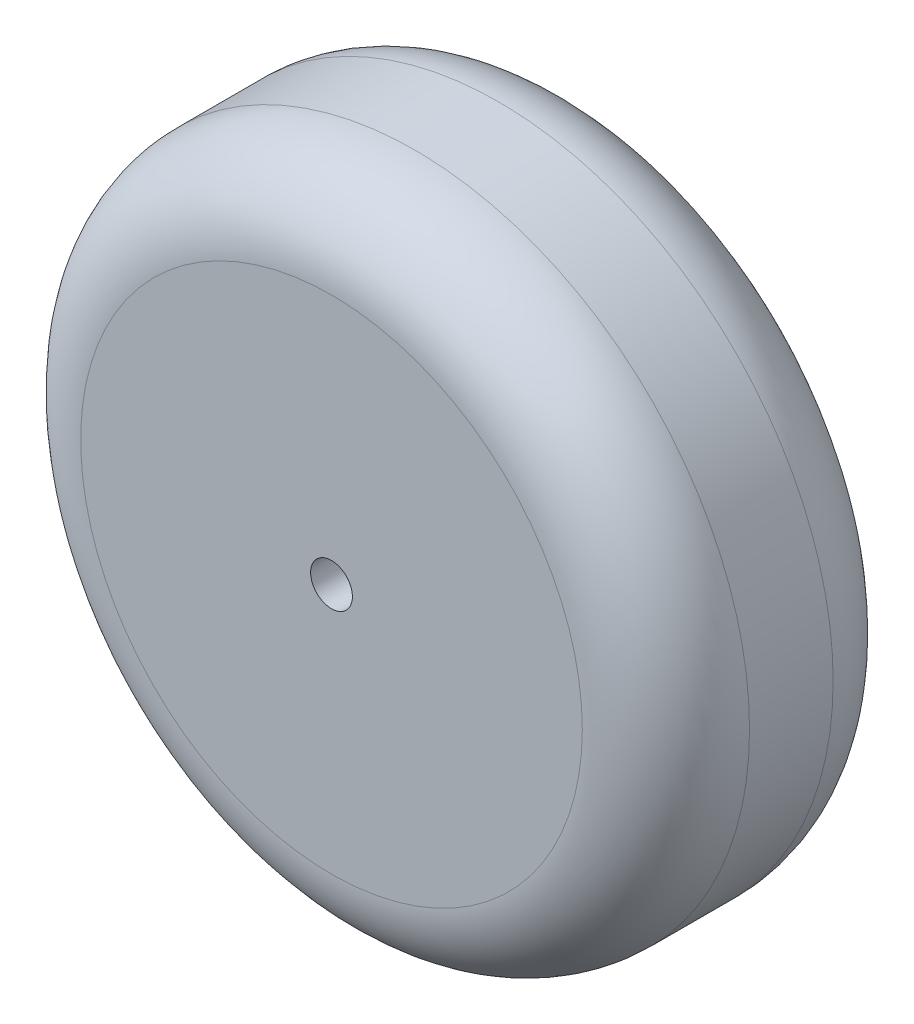
ISO-10303-21;
HEADER;
FILE_DESCRIPTION(('STEP AP214'),'2;1');
FILE_NAME('part.step','',(''),(''),'','','');
FILE_SCHEMA(('AUTOMOTIVE_DESIGN { 1 0 10303 214 1 1 1 1 }'));
ENDSEC;
DATA;
#1=APPLICATION_CONTEXT('core data for automotive mechanical design processes');
#2=APPLICATION_PROTOCOL_DEFINITION('international standard','automotive_design',2000,#1);
#3=PRODUCT_CONTEXT('',#1,'mechanical');
#4=PRODUCT('Part','Part','',(#3));
#5=PRODUCT_RELATED_PRODUCT_CATEGORY('part','',(#4));
#6=PRODUCT_DEFINITION_FORMATION('','',#4);
#7=PRODUCT_DEFINITION_CONTEXT('part definition',#1,'design');
#8=PRODUCT_DEFINITION('design','',#6,#7);
#9=PRODUCT_DEFINITION_SHAPE('','',#8);
#10=(LENGTH_UNIT() NAMED_UNIT(*) SI_UNIT(.MILLI.,.METRE.));
#11=(NAMED_UNIT(*) PLANE_ANGLE_UNIT() SI_UNIT($,.RADIAN.));
#12=(NAMED_UNIT(*) SI_UNIT($,.STERADIAN.) SOLID_ANGLE_UNIT());
#13=UNCERTAINTY_MEASURE_WITH_UNIT(LENGTH_MEASURE(1.E-05),#10,'distance_accuracy_value','');
#14=(GEOMETRIC_REPRESENTATION_CONTEXT(3) GLOBAL_UNCERTAINTY_ASSIGNED_CONTEXT((#13)) GLOBAL_UNIT_ASSIGNED_CONTEXT((#10,
#11,#12)) REPRESENTATION_CONTEXT('',''));
#15=CARTESIAN_POINT('',(0.,0.,0.));
#16=DIRECTION('',(0.,0.,1.));
#17=DIRECTION('',(1.,0.,0.));
#18=AXIS2_PLACEMENT_3D('',#15,#16,#17);
#19=CARTESIAN_POINT('',(0.,0.,30.));
#20=DIRECTION('',(0.,0.,-1.));
#21=DIRECTION('',(-1.,0.,0.));
#22=AXIS2_PLACEMENT_3D('',#19,#20,#21);
#23=CYLINDRICAL_SURFACE('',#22,40.);
#24=CARTESIAN_POINT('',(0.,0.,10.));
#25=DIRECTION('',(0.,0.,1.));
#26=DIRECTION('',(1.,0.,0.));
#27=AXIS2_PLACEMENT_3D('',#24,#25,#26);
#28=CIRCLE('',#27,40.);
#29=CARTESIAN_POINT('',(40.,0.,10.));
#30=VERTEX_POINT('',#29);
#31=EDGE_CURVE('E42',#30,#30,#28,.T.);
#32=ORIENTED_EDGE('',*,*,#31,.T.);
#33=EDGE_LOOP('',(#32));
#34=FACE_BOUND('',#33,.T.);
#35=CARTESIAN_POINT('',(0.,0.,20.));
#36=DIRECTION('',(0.,0.,1.));
#37=DIRECTION('',(1.,0.,0.));
#38=AXIS2_PLACEMENT_3D('',#35,#36,#37);
#39=CIRCLE('',#38,40.);
#40=CARTESIAN_POINT('',(40.,0.,20.));
#41=VERTEX_POINT('',#40);
#42=EDGE_CURVE('E46',#41,#41,#39,.F.);
#43=ORIENTED_EDGE('',*,*,#42,.T.);
#44=EDGE_LOOP('',(#43));
#45=FACE_BOUND('',#44,.T.);
#46=ADVANCED_FACE('F31',(#34,#45),#23,.T.);
#47=CARTESIAN_POINT('',(0.,0.,30.));
#48=DIRECTION('',(0.,0.,1.));
#49=DIRECTION('',(1.,0.,0.));
#50=AXIS2_PLACEMENT_3D('',#47,#48,#49);
#51=PLANE('',#50);
#52=CARTESIAN_POINT('',(0.,0.,30.));
#53=DIRECTION('',(0.,0.,1.));
#54=DIRECTION('',(1.,0.,0.));
#55=AXIS2_PLACEMENT_3D('',#52,#53,#54);
#56=CIRCLE('',#55,2.5);
#57=CARTESIAN_POINT('',(2.5,0.,30.));
#58=VERTEX_POINT('',#57);
#59=EDGE_CURVE('E52',#58,#58,#56,.T.);
#60=ORIENTED_EDGE('',*,*,#59,.F.);
#61=EDGE_LOOP('',(#60));
#62=FACE_BOUND('',#61,.T.);
#63=CARTESIAN_POINT('',(0.,0.,30.));
#64=DIRECTION('',(0.,0.,1.));
#65=DIRECTION('',(1.,0.,0.));
#66=AXIS2_PLACEMENT_3D('',#63,#64,#65);
#67=CIRCLE('',#66,30.);
#68=CARTESIAN_POINT('',(30.,0.,30.));
#69=VERTEX_POINT('',#68);
#70=EDGE_CURVE('E10',#69,#69,#67,.T.);
#71=ORIENTED_EDGE('',*,*,#70,.T.);
#72=EDGE_LOOP('',(#71));
#73=FACE_BOUND('',#72,.T.);
#74=ADVANCED_FACE('F66',(#62,#73),#51,.T.);
#75=CARTESIAN_POINT('',(0.,0.,0.));
#76=DIRECTION('',(0.,0.,1.));
#77=DIRECTION('',(1.,0.,0.));
#78=AXIS2_PLACEMENT_3D('',#75,#76,#77);
#79=PLANE('',#78);
#80=CARTESIAN_POINT('',(0.,0.,0.));
#81=DIRECTION('',(0.,0.,1.));
#82=DIRECTION('',(1.,0.,0.));
#83=AXIS2_PLACEMENT_3D('',#80,#81,#82);
#84=CIRCLE('',#83,2.5);
#85=CARTESIAN_POINT('',(2.5,0.,0.));
#86=VERTEX_POINT('',#85);
#87=EDGE_CURVE('E51',#86,#86,#84,.T.);
#88=ORIENTED_EDGE('',*,*,#87,.T.);
#89=EDGE_LOOP('',(#88));
#90=FACE_BOUND('',#89,.T.);
#91=CARTESIAN_POINT('',(0.,0.,0.));
#92=DIRECTION('',(0.,0.,1.));
#93=DIRECTION('',(1.,0.,0.));
#94=AXIS2_PLACEMENT_3D('',#91,#92,#93);
#95=CIRCLE('',#94,30.);
#96=CARTESIAN_POINT('',(30.,0.,0.));
#97=VERTEX_POINT('',#96);
#98=EDGE_CURVE('E38',#97,#97,#95,.F.);
#99=ORIENTED_EDGE('',*,*,#98,.T.);
#100=EDGE_LOOP('',(#99));
#101=FACE_BOUND('',#100,.T.);
#102=ADVANCED_FACE('F58',(#90,#101),#79,.F.);
#103=CARTESIAN_POINT('',(0.,0.,10.));
#104=DIRECTION('',(0.,0.,1.));
#105=DIRECTION('',(1.,0.,0.));
#106=AXIS2_PLACEMENT_3D('',#103,#104,#105);
#107=TOROIDAL_SURFACE('',#106,30.,10.);
#108=ORIENTED_EDGE('',*,*,#98,.F.);
#109=EDGE_LOOP('',(#108));
#110=FACE_BOUND('',#109,.T.);
#111=ORIENTED_EDGE('',*,*,#31,.F.);
#112=EDGE_LOOP('',(#111));
#113=FACE_BOUND('',#112,.T.);
#114=ADVANCED_FACE('F73',(#110,#113),#107,.T.);
#115=CARTESIAN_POINT('',(0.,0.,20.));
#116=DIRECTION('',(0.,0.,1.));
#117=DIRECTION('',(1.,0.,0.));
#118=AXIS2_PLACEMENT_3D('',#115,#116,#117);
#119=TOROIDAL_SURFACE('',#118,30.,10.);
#120=ORIENTED_EDGE('',*,*,#42,.F.);
#121=EDGE_LOOP('',(#120));
#122=FACE_BOUND('',#121,.T.);
#123=ORIENTED_EDGE('',*,*,#70,.F.);
#124=EDGE_LOOP('',(#123));
#125=FACE_BOUND('',#124,.T.);
#126=ADVANCED_FACE('F33',(#122,#125),#119,.T.);
#127=CARTESIAN_POINT('',(0.,0.,0.));
#128=DIRECTION('',(0.,0.,1.));
#129=DIRECTION('',(1.,0.,0.));
#130=AXIS2_PLACEMENT_3D('',#127,#128,#129);
#131=CYLINDRICAL_SURFACE('',#130,2.5);
#132=ORIENTED_EDGE('',*,*,#87,.F.);
#133=EDGE_LOOP('',(#132));
#134=FACE_BOUND('',#133,.T.);
#135=ORIENTED_EDGE('',*,*,#59,.T.);
#136=EDGE_LOOP('',(#135));
#137=FACE_BOUND('',#136,.T.);
#138=ADVANCED_FACE('F60',(#134,#137),#131,.F.);
#139=CLOSED_SHELL('',(#46,#74,#102,#114,#126,#138));
#140=MANIFOLD_SOLID_BREP('B2',#139);
#141=ADVANCED_BREP_SHAPE_REPRESENTATION('',(#18,#140),#14);
#142=SHAPE_DEFINITION_REPRESENTATION(#9,#141);
ENDSEC;
END-ISO-10303-21;
